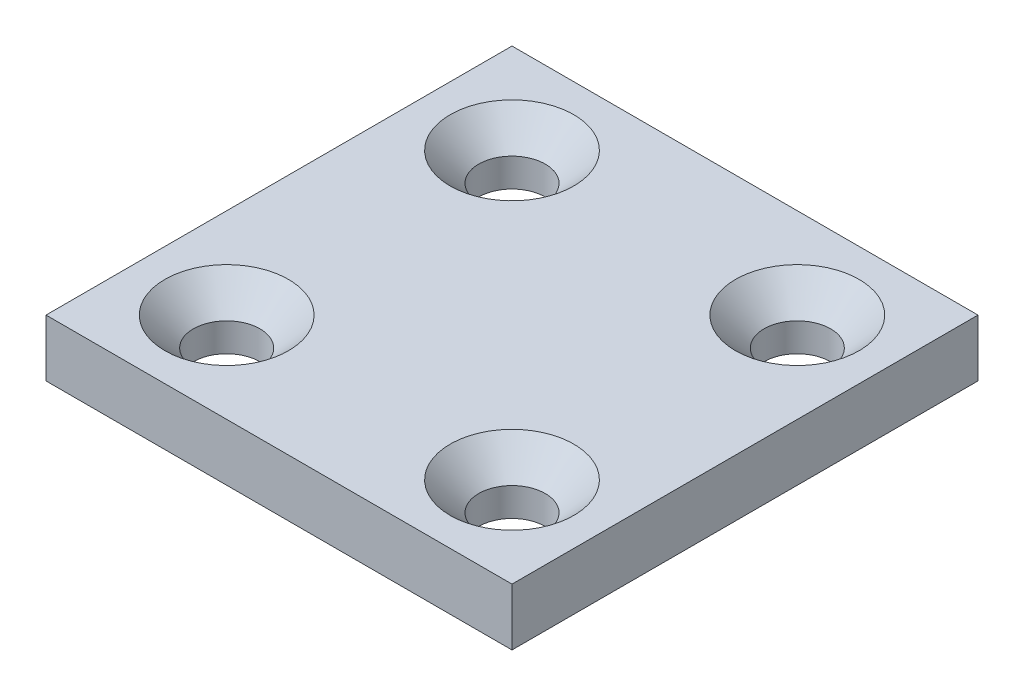
ISO-10303-21;
HEADER;
FILE_DESCRIPTION(('STEP AP214'),'2;1');
FILE_NAME('part.step','',(''),(''),'','','');
FILE_SCHEMA(('AUTOMOTIVE_DESIGN { 1 0 10303 214 1 1 1 1 }'));
ENDSEC;
DATA;
#1=APPLICATION_CONTEXT('core data for automotive mechanical design processes');
#2=APPLICATION_PROTOCOL_DEFINITION('international standard','automotive_design',2000,#1);
#3=PRODUCT_CONTEXT('',#1,'mechanical');
#4=PRODUCT('Part','Part','',(#3));
#5=PRODUCT_RELATED_PRODUCT_CATEGORY('part','',(#4));
#6=PRODUCT_DEFINITION_FORMATION('','',#4);
#7=PRODUCT_DEFINITION_CONTEXT('part definition',#1,'design');
#8=PRODUCT_DEFINITION('design','',#6,#7);
#9=PRODUCT_DEFINITION_SHAPE('','',#8);
#10=(LENGTH_UNIT() NAMED_UNIT(*) SI_UNIT(.MILLI.,.METRE.));
#11=(NAMED_UNIT(*) PLANE_ANGLE_UNIT() SI_UNIT($,.RADIAN.));
#12=(NAMED_UNIT(*) SI_UNIT($,.STERADIAN.) SOLID_ANGLE_UNIT());
#13=UNCERTAINTY_MEASURE_WITH_UNIT(LENGTH_MEASURE(1.E-05),#10,'distance_accuracy_value','');
#14=(GEOMETRIC_REPRESENTATION_CONTEXT(3) GLOBAL_UNCERTAINTY_ASSIGNED_CONTEXT((#13)) GLOBAL_UNIT_ASSIGNED_CONTEXT((#10,
#11,#12)) REPRESENTATION_CONTEXT('',''));
#15=CARTESIAN_POINT('',(0.,0.,0.));
#16=DIRECTION('',(0.,0.,1.));
#17=DIRECTION('',(1.,0.,0.));
#18=AXIS2_PLACEMENT_3D('',#15,#16,#17);
#19=CARTESIAN_POINT('',(0.,3.,0.));
#20=DIRECTION('',(0.,-1.,0.));
#21=DIRECTION('',(0.,0.,-1.));
#22=AXIS2_PLACEMENT_3D('',#19,#20,#21);
#23=PLANE('',#22);
#24=CARTESIAN_POINT('',(0.,3.,-15.));
#25=DIRECTION('',(0.,1.,0.));
#26=DIRECTION('',(0.,0.,1.));
#27=AXIS2_PLACEMENT_3D('',#24,#25,#26);
#28=CIRCLE('',#27,3.25);
#29=CARTESIAN_POINT('',(0.,3.,-11.75));
#30=VERTEX_POINT('',#29);
#31=EDGE_CURVE('E154',#30,#30,#28,.T.);
#32=ORIENTED_EDGE('',*,*,#31,.F.);
#33=EDGE_LOOP('',(#32));
#34=FACE_BOUND('',#33,.T.);
#35=DIRECTION('',(0.,0.,1.));
#36=VECTOR('',#35,1.);
#37=CARTESIAN_POINT('',(-4.75,3.,4.75));
#38=LINE('',#37,#36);
#39=CARTESIAN_POINT('',(-4.75,3.,-19.75));
#40=VERTEX_POINT('',#39);
#41=CARTESIAN_POINT('',(-4.75,3.,4.75));
#42=VERTEX_POINT('',#41);
#43=EDGE_CURVE('E99',#40,#42,#38,.T.);
#44=ORIENTED_EDGE('',*,*,#43,.T.);
#45=DIRECTION('',(1.,0.,0.));
#46=VECTOR('',#45,1.);
#47=CARTESIAN_POINT('',(-4.75,3.,4.75));
#48=LINE('',#47,#46);
#49=CARTESIAN_POINT('',(19.75,3.,4.75));
#50=VERTEX_POINT('',#49);
#51=EDGE_CURVE('E92',#42,#50,#48,.T.);
#52=ORIENTED_EDGE('',*,*,#51,.T.);
#53=DIRECTION('',(0.,0.,-1.));
#54=VECTOR('',#53,1.);
#55=CARTESIAN_POINT('',(19.75,3.,4.75));
#56=LINE('',#55,#54);
#57=CARTESIAN_POINT('',(19.75,3.,-19.75));
#58=VERTEX_POINT('',#57);
#59=EDGE_CURVE('E98',#50,#58,#56,.T.);
#60=ORIENTED_EDGE('',*,*,#59,.T.);
#61=DIRECTION('',(-1.,0.,0.));
#62=VECTOR('',#61,1.);
#63=CARTESIAN_POINT('',(-4.75,3.,-19.75));
#64=LINE('',#63,#62);
#65=EDGE_CURVE('E63',#58,#40,#64,.T.);
#66=ORIENTED_EDGE('',*,*,#65,.T.);
#67=EDGE_LOOP('',(#44,#52,#60,#66));
#68=FACE_BOUND('',#67,.T.);
#69=CARTESIAN_POINT('',(15.,3.,-15.));
#70=DIRECTION('',(0.,1.,0.));
#71=DIRECTION('',(0.,0.,1.));
#72=AXIS2_PLACEMENT_3D('',#69,#70,#71);
#73=CIRCLE('',#72,3.25);
#74=CARTESIAN_POINT('',(15.,3.,-11.75));
#75=VERTEX_POINT('',#74);
#76=EDGE_CURVE('E131',#75,#75,#73,.T.);
#77=ORIENTED_EDGE('',*,*,#76,.F.);
#78=EDGE_LOOP('',(#77));
#79=FACE_BOUND('',#78,.T.);
#80=CARTESIAN_POINT('',(15.,3.,0.));
#81=DIRECTION('',(0.,1.,0.));
#82=DIRECTION('',(0.,0.,1.));
#83=AXIS2_PLACEMENT_3D('',#80,#81,#82);
#84=CIRCLE('',#83,3.25);
#85=CARTESIAN_POINT('',(15.,3.,3.25));
#86=VERTEX_POINT('',#85);
#87=EDGE_CURVE('E133',#86,#86,#84,.T.);
#88=ORIENTED_EDGE('',*,*,#87,.F.);
#89=EDGE_LOOP('',(#88));
#90=FACE_BOUND('',#89,.T.);
#91=CARTESIAN_POINT('',(0.,3.,0.));
#92=DIRECTION('',(0.,1.,0.));
#93=DIRECTION('',(0.,0.,1.));
#94=AXIS2_PLACEMENT_3D('',#91,#92,#93);
#95=CIRCLE('',#94,3.25);
#96=CARTESIAN_POINT('',(0.,3.,3.25));
#97=VERTEX_POINT('',#96);
#98=EDGE_CURVE('E149',#97,#97,#95,.T.);
#99=ORIENTED_EDGE('',*,*,#98,.F.);
#100=EDGE_LOOP('',(#99));
#101=FACE_BOUND('',#100,.T.);
#102=ADVANCED_FACE('F44',(#34,#68,#79,#90,#101),#23,.F.);
#103=CARTESIAN_POINT('',(0.,0.,0.));
#104=DIRECTION('',(0.,-1.,0.));
#105=DIRECTION('',(0.,0.,-1.));
#106=AXIS2_PLACEMENT_3D('',#103,#104,#105);
#107=PLANE('',#106);
#108=CARTESIAN_POINT('',(0.,0.,-15.));
#109=DIRECTION('',(0.,1.,0.));
#110=DIRECTION('',(0.,0.,1.));
#111=AXIS2_PLACEMENT_3D('',#108,#109,#110);
#112=CIRCLE('',#111,1.75);
#113=CARTESIAN_POINT('',(0.,0.,-13.25));
#114=VERTEX_POINT('',#113);
#115=EDGE_CURVE('E170',#114,#114,#112,.T.);
#116=ORIENTED_EDGE('',*,*,#115,.T.);
#117=EDGE_LOOP('',(#116));
#118=FACE_BOUND('',#117,.T.);
#119=CARTESIAN_POINT('',(0.,0.,0.));
#120=DIRECTION('',(0.,1.,0.));
#121=DIRECTION('',(0.,0.,1.));
#122=AXIS2_PLACEMENT_3D('',#119,#120,#121);
#123=CIRCLE('',#122,1.75);
#124=CARTESIAN_POINT('',(0.,0.,1.75));
#125=VERTEX_POINT('',#124);
#126=EDGE_CURVE('E122',#125,#125,#123,.T.);
#127=ORIENTED_EDGE('',*,*,#126,.T.);
#128=EDGE_LOOP('',(#127));
#129=FACE_BOUND('',#128,.T.);
#130=DIRECTION('',(0.,0.,1.));
#131=VECTOR('',#130,1.);
#132=CARTESIAN_POINT('',(-4.75,0.,4.75));
#133=LINE('',#132,#131);
#134=CARTESIAN_POINT('',(-4.75,0.,-19.75));
#135=VERTEX_POINT('',#134);
#136=CARTESIAN_POINT('',(-4.75,0.,4.75));
#137=VERTEX_POINT('',#136);
#138=EDGE_CURVE('E120',#135,#137,#133,.T.);
#139=ORIENTED_EDGE('',*,*,#138,.F.);
#140=DIRECTION('',(-1.,0.,0.));
#141=VECTOR('',#140,1.);
#142=CARTESIAN_POINT('',(-4.75,0.,-19.75));
#143=LINE('',#142,#141);
#144=CARTESIAN_POINT('',(19.75,0.,-19.75));
#145=VERTEX_POINT('',#144);
#146=EDGE_CURVE('E86',#145,#135,#143,.T.);
#147=ORIENTED_EDGE('',*,*,#146,.F.);
#148=DIRECTION('',(0.,0.,-1.));
#149=VECTOR('',#148,1.);
#150=CARTESIAN_POINT('',(19.75,0.,4.75));
#151=LINE('',#150,#149);
#152=CARTESIAN_POINT('',(19.75,0.,4.75));
#153=VERTEX_POINT('',#152);
#154=EDGE_CURVE('E85',#153,#145,#151,.T.);
#155=ORIENTED_EDGE('',*,*,#154,.F.);
#156=DIRECTION('',(1.,0.,0.));
#157=VECTOR('',#156,1.);
#158=CARTESIAN_POINT('',(-4.75,0.,4.75));
#159=LINE('',#158,#157);
#160=EDGE_CURVE('E104',#137,#153,#159,.T.);
#161=ORIENTED_EDGE('',*,*,#160,.F.);
#162=EDGE_LOOP('',(#139,#147,#155,#161));
#163=FACE_BOUND('',#162,.T.);
#164=CARTESIAN_POINT('',(15.,0.,0.));
#165=DIRECTION('',(0.,1.,0.));
#166=DIRECTION('',(0.,0.,1.));
#167=AXIS2_PLACEMENT_3D('',#164,#165,#166);
#168=CIRCLE('',#167,1.75);
#169=CARTESIAN_POINT('',(15.,0.,1.75));
#170=VERTEX_POINT('',#169);
#171=EDGE_CURVE('E172',#170,#170,#168,.T.);
#172=ORIENTED_EDGE('',*,*,#171,.T.);
#173=EDGE_LOOP('',(#172));
#174=FACE_BOUND('',#173,.T.);
#175=CARTESIAN_POINT('',(15.,0.,-15.));
#176=DIRECTION('',(0.,1.,0.));
#177=DIRECTION('',(0.,0.,1.));
#178=AXIS2_PLACEMENT_3D('',#175,#176,#177);
#179=CIRCLE('',#178,1.75);
#180=CARTESIAN_POINT('',(15.,0.,-13.25));
#181=VERTEX_POINT('',#180);
#182=EDGE_CURVE('E162',#181,#181,#179,.T.);
#183=ORIENTED_EDGE('',*,*,#182,.T.);
#184=EDGE_LOOP('',(#183));
#185=FACE_BOUND('',#184,.T.);
#186=ADVANCED_FACE('F176',(#118,#129,#163,#174,#185),#107,.T.);
#187=CARTESIAN_POINT('',(-4.75,3.,4.75));
#188=DIRECTION('',(1.,0.,0.));
#189=DIRECTION('',(0.,0.,-1.));
#190=AXIS2_PLACEMENT_3D('',#187,#188,#189);
#191=PLANE('',#190);
#192=ORIENTED_EDGE('',*,*,#138,.T.);
#193=DIRECTION('',(0.,-1.,0.));
#194=VECTOR('',#193,1.);
#195=CARTESIAN_POINT('',(-4.75,3.,4.75));
#196=LINE('',#195,#194);
#197=EDGE_CURVE('E11',#42,#137,#196,.T.);
#198=ORIENTED_EDGE('',*,*,#197,.F.);
#199=ORIENTED_EDGE('',*,*,#43,.F.);
#200=DIRECTION('',(0.,-1.,0.));
#201=VECTOR('',#200,1.);
#202=CARTESIAN_POINT('',(-4.75,3.,-19.75));
#203=LINE('',#202,#201);
#204=EDGE_CURVE('E114',#40,#135,#203,.T.);
#205=ORIENTED_EDGE('',*,*,#204,.T.);
#206=EDGE_LOOP('',(#192,#198,#199,#205));
#207=FACE_BOUND('',#206,.T.);
#208=ADVANCED_FACE('F50',(#207),#191,.F.);
#209=CARTESIAN_POINT('',(-4.75,3.,4.75));
#210=DIRECTION('',(0.,0.,-1.));
#211=DIRECTION('',(-1.,0.,0.));
#212=AXIS2_PLACEMENT_3D('',#209,#210,#211);
#213=PLANE('',#212);
#214=ORIENTED_EDGE('',*,*,#160,.T.);
#215=DIRECTION('',(0.,-1.,0.));
#216=VECTOR('',#215,1.);
#217=CARTESIAN_POINT('',(19.75,3.,4.75));
#218=LINE('',#217,#216);
#219=EDGE_CURVE('E57',#50,#153,#218,.T.);
#220=ORIENTED_EDGE('',*,*,#219,.F.);
#221=ORIENTED_EDGE('',*,*,#51,.F.);
#222=ORIENTED_EDGE('',*,*,#197,.T.);
#223=EDGE_LOOP('',(#214,#220,#221,#222));
#224=FACE_BOUND('',#223,.T.);
#225=ADVANCED_FACE('F102',(#224),#213,.F.);
#226=CARTESIAN_POINT('',(19.75,3.,4.75));
#227=DIRECTION('',(-1.,0.,0.));
#228=DIRECTION('',(0.,0.,1.));
#229=AXIS2_PLACEMENT_3D('',#226,#227,#228);
#230=PLANE('',#229);
#231=ORIENTED_EDGE('',*,*,#154,.T.);
#232=DIRECTION('',(0.,-1.,0.));
#233=VECTOR('',#232,1.);
#234=CARTESIAN_POINT('',(19.75,3.,-19.75));
#235=LINE('',#234,#233);
#236=EDGE_CURVE('E110',#58,#145,#235,.T.);
#237=ORIENTED_EDGE('',*,*,#236,.F.);
#238=ORIENTED_EDGE('',*,*,#59,.F.);
#239=ORIENTED_EDGE('',*,*,#219,.T.);
#240=EDGE_LOOP('',(#231,#237,#238,#239));
#241=FACE_BOUND('',#240,.T.);
#242=ADVANCED_FACE('F108',(#241),#230,.F.);
#243=CARTESIAN_POINT('',(-4.75,3.,-19.75));
#244=DIRECTION('',(0.,0.,1.));
#245=DIRECTION('',(1.,0.,0.));
#246=AXIS2_PLACEMENT_3D('',#243,#244,#245);
#247=PLANE('',#246);
#248=ORIENTED_EDGE('',*,*,#146,.T.);
#249=ORIENTED_EDGE('',*,*,#204,.F.);
#250=ORIENTED_EDGE('',*,*,#65,.F.);
#251=ORIENTED_EDGE('',*,*,#236,.T.);
#252=EDGE_LOOP('',(#248,#249,#250,#251));
#253=FACE_BOUND('',#252,.T.);
#254=ADVANCED_FACE('F187',(#253),#247,.F.);
#255=CARTESIAN_POINT('',(0.,3.,0.));
#256=DIRECTION('',(0.,-1.,0.));
#257=DIRECTION('',(0.,0.,-1.));
#258=AXIS2_PLACEMENT_3D('',#255,#256,#257);
#259=CYLINDRICAL_SURFACE('',#258,1.75);
#260=CARTESIAN_POINT('',(0.,1.5,0.));
#261=DIRECTION('',(0.,1.,0.));
#262=DIRECTION('',(0.,0.,1.));
#263=AXIS2_PLACEMENT_3D('',#260,#261,#262);
#264=CIRCLE('',#263,1.75);
#265=CARTESIAN_POINT('',(0.,1.5,1.75));
#266=VERTEX_POINT('',#265);
#267=EDGE_CURVE('E47',#266,#266,#264,.F.);
#268=ORIENTED_EDGE('',*,*,#267,.F.);
#269=EDGE_LOOP('',(#268));
#270=FACE_BOUND('',#269,.T.);
#271=ORIENTED_EDGE('',*,*,#126,.F.);
#272=EDGE_LOOP('',(#271));
#273=FACE_BOUND('',#272,.T.);
#274=ADVANCED_FACE('F181',(#270,#273),#259,.F.);
#275=CARTESIAN_POINT('',(15.,3.,0.));
#276=DIRECTION('',(0.,-1.,0.));
#277=DIRECTION('',(0.,0.,-1.));
#278=AXIS2_PLACEMENT_3D('',#275,#276,#277);
#279=CYLINDRICAL_SURFACE('',#278,1.75);
#280=CARTESIAN_POINT('',(15.,1.5,0.));
#281=DIRECTION('',(0.,1.,0.));
#282=DIRECTION('',(0.,0.,1.));
#283=AXIS2_PLACEMENT_3D('',#280,#281,#282);
#284=CIRCLE('',#283,1.75);
#285=CARTESIAN_POINT('',(15.,1.5,1.75));
#286=VERTEX_POINT('',#285);
#287=EDGE_CURVE('E132',#286,#286,#284,.F.);
#288=ORIENTED_EDGE('',*,*,#287,.F.);
#289=EDGE_LOOP('',(#288));
#290=FACE_BOUND('',#289,.T.);
#291=ORIENTED_EDGE('',*,*,#171,.F.);
#292=EDGE_LOOP('',(#291));
#293=FACE_BOUND('',#292,.T.);
#294=ADVANCED_FACE('F183',(#290,#293),#279,.F.);
#295=CARTESIAN_POINT('',(0.,3.,-15.));
#296=DIRECTION('',(0.,-1.,0.));
#297=DIRECTION('',(0.,0.,-1.));
#298=AXIS2_PLACEMENT_3D('',#295,#296,#297);
#299=CYLINDRICAL_SURFACE('',#298,1.75);
#300=CARTESIAN_POINT('',(0.,1.5,-15.));
#301=DIRECTION('',(0.,1.,0.));
#302=DIRECTION('',(0.,0.,1.));
#303=AXIS2_PLACEMENT_3D('',#300,#301,#302);
#304=CIRCLE('',#303,1.75);
#305=CARTESIAN_POINT('',(0.,1.5,-13.25));
#306=VERTEX_POINT('',#305);
#307=EDGE_CURVE('E157',#306,#306,#304,.F.);
#308=ORIENTED_EDGE('',*,*,#307,.F.);
#309=EDGE_LOOP('',(#308));
#310=FACE_BOUND('',#309,.T.);
#311=ORIENTED_EDGE('',*,*,#115,.F.);
#312=EDGE_LOOP('',(#311));
#313=FACE_BOUND('',#312,.T.);
#314=ADVANCED_FACE('F193',(#310,#313),#299,.F.);
#315=CARTESIAN_POINT('',(15.,3.,-15.));
#316=DIRECTION('',(0.,-1.,0.));
#317=DIRECTION('',(0.,0.,-1.));
#318=AXIS2_PLACEMENT_3D('',#315,#316,#317);
#319=CYLINDRICAL_SURFACE('',#318,1.75);
#320=CARTESIAN_POINT('',(15.,1.5,-15.));
#321=DIRECTION('',(0.,1.,0.));
#322=DIRECTION('',(0.,0.,1.));
#323=AXIS2_PLACEMENT_3D('',#320,#321,#322);
#324=CIRCLE('',#323,1.75);
#325=CARTESIAN_POINT('',(15.,1.5,-13.25));
#326=VERTEX_POINT('',#325);
#327=EDGE_CURVE('E143',#326,#326,#324,.F.);
#328=ORIENTED_EDGE('',*,*,#327,.F.);
#329=EDGE_LOOP('',(#328));
#330=FACE_BOUND('',#329,.T.);
#331=ORIENTED_EDGE('',*,*,#182,.F.);
#332=EDGE_LOOP('',(#331));
#333=FACE_BOUND('',#332,.T.);
#334=ADVANCED_FACE('F225',(#330,#333),#319,.F.);
#335=CARTESIAN_POINT('',(0.,3.,-15.));
#336=DIRECTION('',(0.,1.,0.));
#337=DIRECTION('',(0.,0.,1.));
#338=AXIS2_PLACEMENT_3D('',#335,#336,#337);
#339=CONICAL_SURFACE('',#338,3.25,0.785398163397448);
#340=ORIENTED_EDGE('',*,*,#307,.T.);
#341=EDGE_LOOP('',(#340));
#342=FACE_BOUND('',#341,.T.);
#343=ORIENTED_EDGE('',*,*,#31,.T.);
#344=EDGE_LOOP('',(#343));
#345=FACE_BOUND('',#344,.T.);
#346=ADVANCED_FACE('F221',(#342,#345),#339,.F.);
#347=CARTESIAN_POINT('',(15.,3.,-15.));
#348=DIRECTION('',(0.,1.,0.));
#349=DIRECTION('',(0.,0.,1.));
#350=AXIS2_PLACEMENT_3D('',#347,#348,#349);
#351=CONICAL_SURFACE('',#350,3.25,0.785398163397449);
#352=ORIENTED_EDGE('',*,*,#327,.T.);
#353=EDGE_LOOP('',(#352));
#354=FACE_BOUND('',#353,.T.);
#355=ORIENTED_EDGE('',*,*,#76,.T.);
#356=EDGE_LOOP('',(#355));
#357=FACE_BOUND('',#356,.T.);
#358=ADVANCED_FACE('F232',(#354,#357),#351,.F.);
#359=CARTESIAN_POINT('',(15.,3.,0.));
#360=DIRECTION('',(0.,1.,0.));
#361=DIRECTION('',(0.,0.,1.));
#362=AXIS2_PLACEMENT_3D('',#359,#360,#361);
#363=CONICAL_SURFACE('',#362,3.25,0.785398163397449);
#364=ORIENTED_EDGE('',*,*,#287,.T.);
#365=EDGE_LOOP('',(#364));
#366=FACE_BOUND('',#365,.T.);
#367=ORIENTED_EDGE('',*,*,#87,.T.);
#368=EDGE_LOOP('',(#367));
#369=FACE_BOUND('',#368,.T.);
#370=ADVANCED_FACE('F238',(#366,#369),#363,.F.);
#371=CARTESIAN_POINT('',(0.,3.,0.));
#372=DIRECTION('',(0.,1.,0.));
#373=DIRECTION('',(0.,0.,1.));
#374=AXIS2_PLACEMENT_3D('',#371,#372,#373);
#375=CONICAL_SURFACE('',#374,3.25,0.785398163397448);
#376=ORIENTED_EDGE('',*,*,#267,.T.);
#377=EDGE_LOOP('',(#376));
#378=FACE_BOUND('',#377,.T.);
#379=ORIENTED_EDGE('',*,*,#98,.T.);
#380=EDGE_LOOP('',(#379));
#381=FACE_BOUND('',#380,.T.);
#382=ADVANCED_FACE('F241',(#378,#381),#375,.F.);
#383=CLOSED_SHELL('',(#102,#186,#208,#225,#242,#254,#274,#294,#314,#334,#346,#358,#370,#382));
#384=MANIFOLD_SOLID_BREP('B2',#383);
#385=ADVANCED_BREP_SHAPE_REPRESENTATION('',(#18,#384),#14);
#386=SHAPE_DEFINITION_REPRESENTATION(#9,#385);
ENDSEC;
END-ISO-10303-21;
